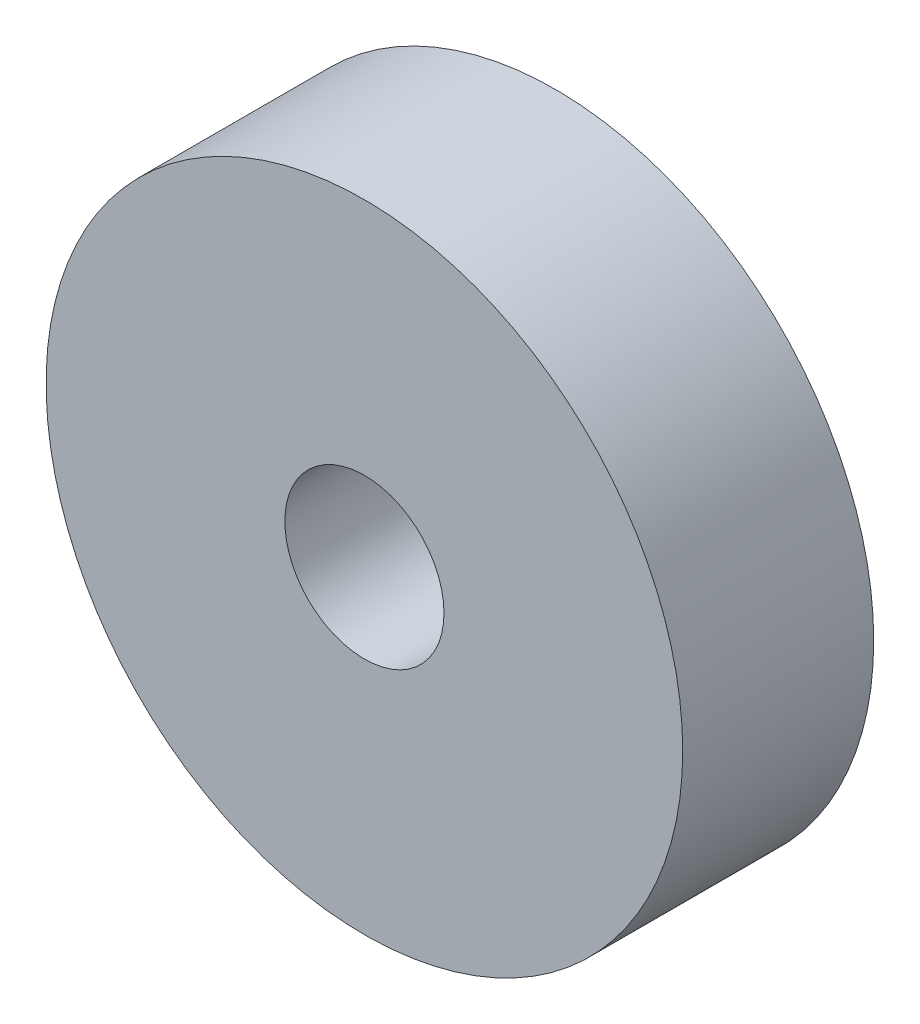
ISO-10303-21;
HEADER;
FILE_DESCRIPTION(('STEP AP214'),'2;1');
FILE_NAME('part.step','',(''),(''),'','','');
FILE_SCHEMA(('AUTOMOTIVE_DESIGN { 1 0 10303 214 1 1 1 1 }'));
ENDSEC;
DATA;
#1=APPLICATION_CONTEXT('core data for automotive mechanical design processes');
#2=APPLICATION_PROTOCOL_DEFINITION('international standard','automotive_design',2000,#1);
#3=PRODUCT_CONTEXT('',#1,'mechanical');
#4=PRODUCT('Part','Part','',(#3));
#5=PRODUCT_RELATED_PRODUCT_CATEGORY('part','',(#4));
#6=PRODUCT_DEFINITION_FORMATION('','',#4);
#7=PRODUCT_DEFINITION_CONTEXT('part definition',#1,'design');
#8=PRODUCT_DEFINITION('design','',#6,#7);
#9=PRODUCT_DEFINITION_SHAPE('','',#8);
#10=(LENGTH_UNIT() NAMED_UNIT(*) SI_UNIT(.MILLI.,.METRE.));
#11=(NAMED_UNIT(*) PLANE_ANGLE_UNIT() SI_UNIT($,.RADIAN.));
#12=(NAMED_UNIT(*) SI_UNIT($,.STERADIAN.) SOLID_ANGLE_UNIT());
#13=UNCERTAINTY_MEASURE_WITH_UNIT(LENGTH_MEASURE(1.E-05),#10,'distance_accuracy_value','');
#14=(GEOMETRIC_REPRESENTATION_CONTEXT(3) GLOBAL_UNCERTAINTY_ASSIGNED_CONTEXT((#13)) GLOBAL_UNIT_ASSIGNED_CONTEXT((#10,
#11,#12)) REPRESENTATION_CONTEXT('',''));
#15=CARTESIAN_POINT('',(0.,0.,0.));
#16=DIRECTION('',(0.,0.,1.));
#17=DIRECTION('',(1.,0.,0.));
#18=AXIS2_PLACEMENT_3D('',#15,#16,#17);
#19=CARTESIAN_POINT('',(0.,0.,3.));
#20=DIRECTION('',(0.,0.,-1.));
#21=DIRECTION('',(-1.,0.,0.));
#22=AXIS2_PLACEMENT_3D('',#19,#20,#21);
#23=CYLINDRICAL_SURFACE('',#22,5.);
#24=CARTESIAN_POINT('',(0.,0.,3.));
#25=DIRECTION('',(0.,0.,1.));
#26=DIRECTION('',(1.,0.,0.));
#27=AXIS2_PLACEMENT_3D('',#24,#25,#26);
#28=CIRCLE('',#27,5.);
#29=CARTESIAN_POINT('',(5.,0.,3.));
#30=VERTEX_POINT('',#29);
#31=EDGE_CURVE('E10',#30,#30,#28,.T.);
#32=ORIENTED_EDGE('',*,*,#31,.F.);
#33=EDGE_LOOP('',(#32));
#34=FACE_BOUND('',#33,.T.);
#35=CARTESIAN_POINT('',(0.,0.,0.));
#36=DIRECTION('',(0.,0.,1.));
#37=DIRECTION('',(1.,0.,0.));
#38=AXIS2_PLACEMENT_3D('',#35,#36,#37);
#39=CIRCLE('',#38,5.);
#40=CARTESIAN_POINT('',(5.,0.,0.));
#41=VERTEX_POINT('',#40);
#42=EDGE_CURVE('E41',#41,#41,#39,.T.);
#43=ORIENTED_EDGE('',*,*,#42,.T.);
#44=EDGE_LOOP('',(#43));
#45=FACE_BOUND('',#44,.T.);
#46=ADVANCED_FACE('F34',(#34,#45),#23,.T.);
#47=CARTESIAN_POINT('',(0.,0.,3.));
#48=DIRECTION('',(0.,0.,1.));
#49=DIRECTION('',(1.,0.,0.));
#50=AXIS2_PLACEMENT_3D('',#47,#48,#49);
#51=PLANE('',#50);
#52=CARTESIAN_POINT('',(0.,0.,3.));
#53=DIRECTION('',(0.,0.,1.));
#54=DIRECTION('',(1.,0.,0.));
#55=AXIS2_PLACEMENT_3D('',#52,#53,#54);
#56=CIRCLE('',#55,1.25);
#57=CARTESIAN_POINT('',(1.25,0.,3.));
#58=VERTEX_POINT('',#57);
#59=EDGE_CURVE('E47',#58,#58,#56,.T.);
#60=ORIENTED_EDGE('',*,*,#59,.F.);
#61=EDGE_LOOP('',(#60));
#62=FACE_BOUND('',#61,.T.);
#63=ORIENTED_EDGE('',*,*,#31,.T.);
#64=EDGE_LOOP('',(#63));
#65=FACE_BOUND('',#64,.T.);
#66=ADVANCED_FACE('F63',(#62,#65),#51,.T.);
#67=CARTESIAN_POINT('',(0.,0.,0.));
#68=DIRECTION('',(0.,0.,1.));
#69=DIRECTION('',(1.,0.,0.));
#70=AXIS2_PLACEMENT_3D('',#67,#68,#69);
#71=PLANE('',#70);
#72=CARTESIAN_POINT('',(0.,0.,0.));
#73=DIRECTION('',(0.,0.,1.));
#74=DIRECTION('',(1.,0.,0.));
#75=AXIS2_PLACEMENT_3D('',#72,#73,#74);
#76=CIRCLE('',#75,1.25);
#77=CARTESIAN_POINT('',(1.25,0.,0.));
#78=VERTEX_POINT('',#77);
#79=EDGE_CURVE('E37',#78,#78,#76,.T.);
#80=ORIENTED_EDGE('',*,*,#79,.T.);
#81=EDGE_LOOP('',(#80));
#82=FACE_BOUND('',#81,.T.);
#83=ORIENTED_EDGE('',*,*,#42,.F.);
#84=EDGE_LOOP('',(#83));
#85=FACE_BOUND('',#84,.T.);
#86=ADVANCED_FACE('F54',(#82,#85),#71,.F.);
#87=CARTESIAN_POINT('',(0.,0.,-5.));
#88=DIRECTION('',(0.,0.,1.));
#89=DIRECTION('',(1.,0.,0.));
#90=AXIS2_PLACEMENT_3D('',#87,#88,#89);
#91=CYLINDRICAL_SURFACE('',#90,1.25);
#92=ORIENTED_EDGE('',*,*,#59,.T.);
#93=EDGE_LOOP('',(#92));
#94=FACE_BOUND('',#93,.T.);
#95=ORIENTED_EDGE('',*,*,#79,.F.);
#96=EDGE_LOOP('',(#95));
#97=FACE_BOUND('',#96,.T.);
#98=ADVANCED_FACE('F57',(#94,#97),#91,.F.);
#99=CLOSED_SHELL('',(#46,#66,#86,#98));
#100=MANIFOLD_SOLID_BREP('B2',#99);
#101=ADVANCED_BREP_SHAPE_REPRESENTATION('',(#18,#100),#14);
#102=SHAPE_DEFINITION_REPRESENTATION(#9,#101);
ENDSEC;
END-ISO-10303-21;
